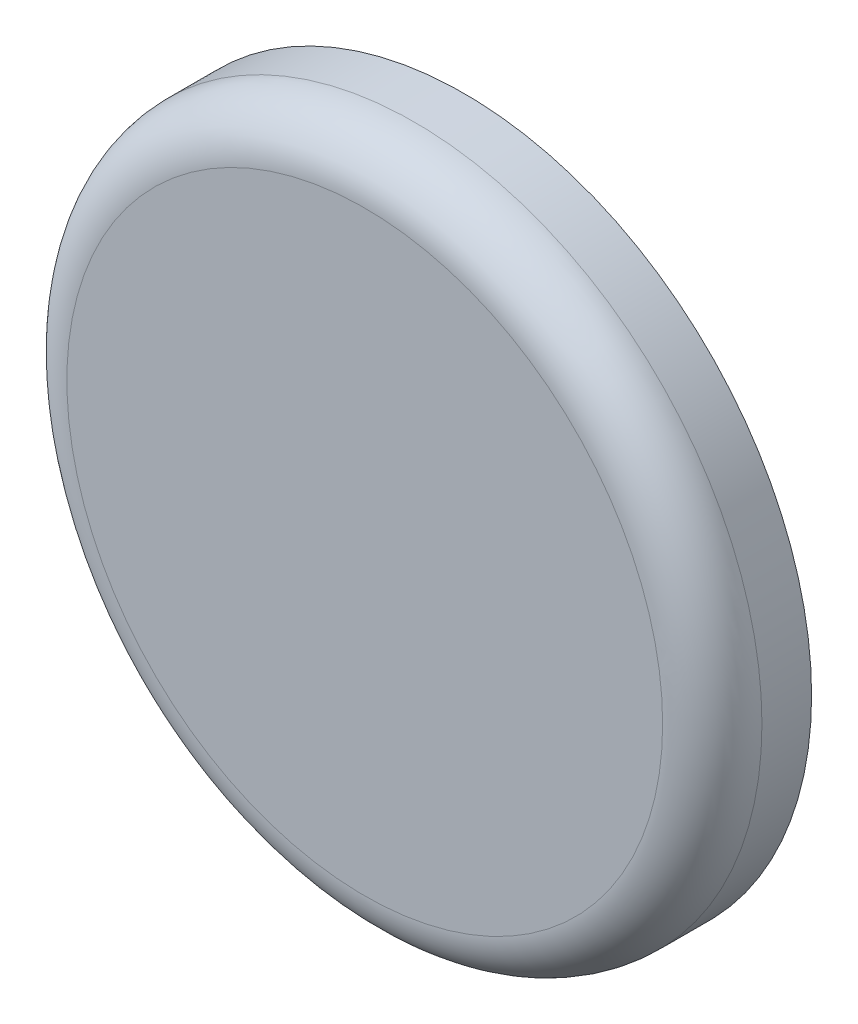
ISO-10303-21;
HEADER;
FILE_DESCRIPTION(('STEP AP214'),'2;1');
FILE_NAME('part.step','',(''),(''),'','','');
FILE_SCHEMA(('AUTOMOTIVE_DESIGN { 1 0 10303 214 1 1 1 1 }'));
ENDSEC;
DATA;
#1=APPLICATION_CONTEXT('core data for automotive mechanical design processes');
#2=APPLICATION_PROTOCOL_DEFINITION('international standard','automotive_design',2000,#1);
#3=PRODUCT_CONTEXT('',#1,'mechanical');
#4=PRODUCT('Part','Part','',(#3));
#5=PRODUCT_RELATED_PRODUCT_CATEGORY('part','',(#4));
#6=PRODUCT_DEFINITION_FORMATION('','',#4);
#7=PRODUCT_DEFINITION_CONTEXT('part definition',#1,'design');
#8=PRODUCT_DEFINITION('design','',#6,#7);
#9=PRODUCT_DEFINITION_SHAPE('','',#8);
#10=(LENGTH_UNIT() NAMED_UNIT(*) SI_UNIT(.MILLI.,.METRE.));
#11=(NAMED_UNIT(*) PLANE_ANGLE_UNIT() SI_UNIT($,.RADIAN.));
#12=(NAMED_UNIT(*) SI_UNIT($,.STERADIAN.) SOLID_ANGLE_UNIT());
#13=UNCERTAINTY_MEASURE_WITH_UNIT(LENGTH_MEASURE(1.E-05),#10,'distance_accuracy_value','');
#14=(GEOMETRIC_REPRESENTATION_CONTEXT(3) GLOBAL_UNCERTAINTY_ASSIGNED_CONTEXT((#13)) GLOBAL_UNIT_ASSIGNED_CONTEXT((#10,
#11,#12)) REPRESENTATION_CONTEXT('',''));
#15=CARTESIAN_POINT('',(0.,0.,0.));
#16=DIRECTION('',(0.,0.,1.));
#17=DIRECTION('',(1.,0.,0.));
#18=AXIS2_PLACEMENT_3D('',#15,#16,#17);
#19=CARTESIAN_POINT('',(0.,0.,2.));
#20=DIRECTION('',(0.,0.,-1.));
#21=DIRECTION('',(-1.,0.,0.));
#22=AXIS2_PLACEMENT_3D('',#19,#20,#21);
#23=CYLINDRICAL_SURFACE('',#22,7.);
#24=CARTESIAN_POINT('',(0.,0.,1.));
#25=DIRECTION('',(0.,0.,1.));
#26=DIRECTION('',(1.,0.,0.));
#27=AXIS2_PLACEMENT_3D('',#24,#25,#26);
#28=CIRCLE('',#27,7.);
#29=CARTESIAN_POINT('',(7.,0.,1.));
#30=VERTEX_POINT('',#29);
#31=EDGE_CURVE('E10',#30,#30,#28,.F.);
#32=ORIENTED_EDGE('',*,*,#31,.T.);
#33=EDGE_LOOP('',(#32));
#34=FACE_BOUND('',#33,.T.);
#35=CARTESIAN_POINT('',(0.,0.,0.));
#36=DIRECTION('',(0.,0.,1.));
#37=DIRECTION('',(1.,0.,0.));
#38=AXIS2_PLACEMENT_3D('',#35,#36,#37);
#39=CIRCLE('',#38,7.);
#40=CARTESIAN_POINT('',(7.,0.,0.));
#41=VERTEX_POINT('',#40);
#42=EDGE_CURVE('E44',#41,#41,#39,.T.);
#43=ORIENTED_EDGE('',*,*,#42,.T.);
#44=EDGE_LOOP('',(#43));
#45=FACE_BOUND('',#44,.T.);
#46=ADVANCED_FACE('F33',(#34,#45),#23,.T.);
#47=CARTESIAN_POINT('',(0.,0.,2.));
#48=DIRECTION('',(0.,0.,1.));
#49=DIRECTION('',(1.,0.,0.));
#50=AXIS2_PLACEMENT_3D('',#47,#48,#49);
#51=PLANE('',#50);
#52=CARTESIAN_POINT('',(0.,0.,2.));
#53=DIRECTION('',(0.,0.,1.));
#54=DIRECTION('',(1.,0.,0.));
#55=AXIS2_PLACEMENT_3D('',#52,#53,#54);
#56=CIRCLE('',#55,6.);
#57=CARTESIAN_POINT('',(6.,0.,2.));
#58=VERTEX_POINT('',#57);
#59=EDGE_CURVE('E40',#58,#58,#56,.T.);
#60=ORIENTED_EDGE('',*,*,#59,.T.);
#61=EDGE_LOOP('',(#60));
#62=FACE_BOUND('',#61,.T.);
#63=ADVANCED_FACE('F54',(#62),#51,.T.);
#64=CARTESIAN_POINT('',(0.,0.,0.));
#65=DIRECTION('',(0.,0.,1.));
#66=DIRECTION('',(1.,0.,0.));
#67=AXIS2_PLACEMENT_3D('',#64,#65,#66);
#68=PLANE('',#67);
#69=ORIENTED_EDGE('',*,*,#42,.F.);
#70=EDGE_LOOP('',(#69));
#71=FACE_BOUND('',#70,.T.);
#72=ADVANCED_FACE('F52',(#71),#68,.F.);
#73=CARTESIAN_POINT('',(0.,0.,1.));
#74=DIRECTION('',(0.,0.,1.));
#75=DIRECTION('',(1.,0.,0.));
#76=AXIS2_PLACEMENT_3D('',#73,#74,#75);
#77=TOROIDAL_SURFACE('',#76,6.,1.);
#78=ORIENTED_EDGE('',*,*,#31,.F.);
#79=EDGE_LOOP('',(#78));
#80=FACE_BOUND('',#79,.T.);
#81=ORIENTED_EDGE('',*,*,#59,.F.);
#82=EDGE_LOOP('',(#81));
#83=FACE_BOUND('',#82,.T.);
#84=ADVANCED_FACE('F35',(#80,#83),#77,.T.);
#85=CLOSED_SHELL('',(#46,#63,#72,#84));
#86=MANIFOLD_SOLID_BREP('B2',#85);
#87=ADVANCED_BREP_SHAPE_REPRESENTATION('',(#18,#86),#14);
#88=SHAPE_DEFINITION_REPRESENTATION(#9,#87);
ENDSEC;
END-ISO-10303-21;
